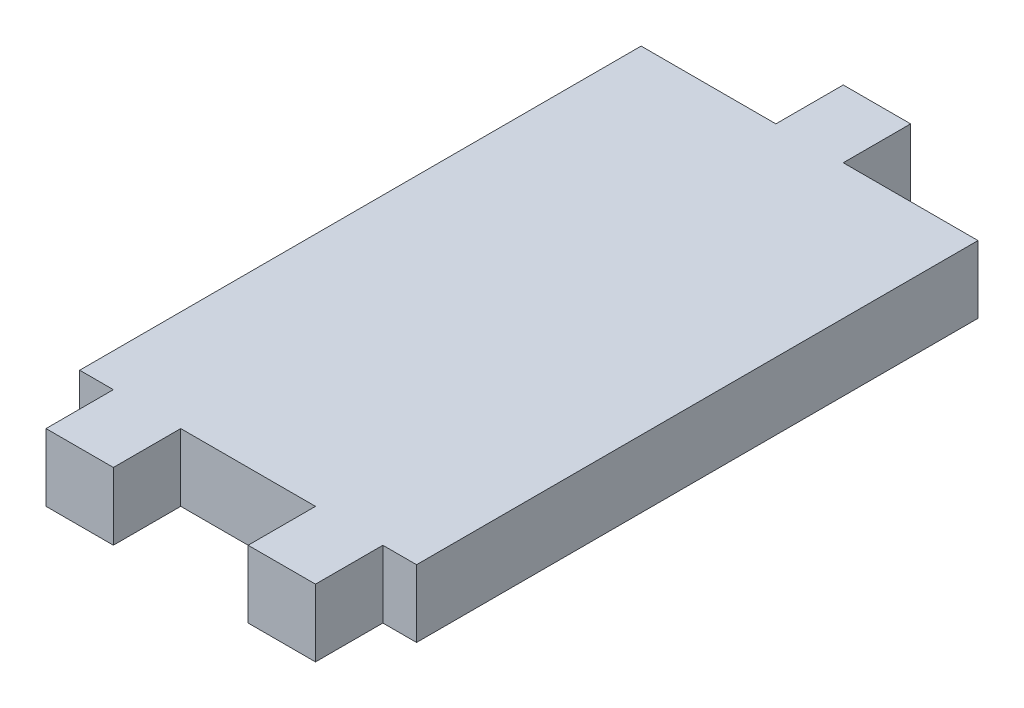
ISO-10303-21;
HEADER;
FILE_DESCRIPTION(('STEP AP214'),'2;1');
FILE_NAME('part.step','',(''),(''),'','','');
FILE_SCHEMA(('AUTOMOTIVE_DESIGN { 1 0 10303 214 1 1 1 1 }'));
ENDSEC;
DATA;
#1=APPLICATION_CONTEXT('core data for automotive mechanical design processes');
#2=APPLICATION_PROTOCOL_DEFINITION('international standard','automotive_design',2000,#1);
#3=PRODUCT_CONTEXT('',#1,'mechanical');
#4=PRODUCT('Part','Part','',(#3));
#5=PRODUCT_RELATED_PRODUCT_CATEGORY('part','',(#4));
#6=PRODUCT_DEFINITION_FORMATION('','',#4);
#7=PRODUCT_DEFINITION_CONTEXT('part definition',#1,'design');
#8=PRODUCT_DEFINITION('design','',#6,#7);
#9=PRODUCT_DEFINITION_SHAPE('','',#8);
#10=(LENGTH_UNIT() NAMED_UNIT(*) SI_UNIT(.MILLI.,.METRE.));
#11=(NAMED_UNIT(*) PLANE_ANGLE_UNIT() SI_UNIT($,.RADIAN.));
#12=(NAMED_UNIT(*) SI_UNIT($,.STERADIAN.) SOLID_ANGLE_UNIT());
#13=UNCERTAINTY_MEASURE_WITH_UNIT(LENGTH_MEASURE(1.E-05),#10,'distance_accuracy_value','');
#14=(GEOMETRIC_REPRESENTATION_CONTEXT(3) GLOBAL_UNCERTAINTY_ASSIGNED_CONTEXT((#13)) GLOBAL_UNIT_ASSIGNED_CONTEXT((#10,
#11,#12)) REPRESENTATION_CONTEXT('',''));
#15=CARTESIAN_POINT('',(0.,0.,0.));
#16=DIRECTION('',(0.,0.,1.));
#17=DIRECTION('',(1.,0.,0.));
#18=AXIS2_PLACEMENT_3D('',#15,#16,#17);
#19=CARTESIAN_POINT('',(-3.,6.,0.));
#20=DIRECTION('',(0.,0.,-1.));
#21=DIRECTION('',(-1.,0.,0.));
#22=AXIS2_PLACEMENT_3D('',#19,#20,#21);
#23=PLANE('',#22);
#24=DIRECTION('',(1.,0.,0.));
#25=VECTOR('',#24,1.);
#26=CARTESIAN_POINT('',(-3.,0.,0.));
#27=LINE('',#26,#25);
#28=CARTESIAN_POINT('',(-3.,0.,0.));
#29=VERTEX_POINT('',#28);
#30=CARTESIAN_POINT('',(0.,0.,0.));
#31=VERTEX_POINT('',#30);
#32=EDGE_CURVE('E177',#29,#31,#27,.T.);
#33=ORIENTED_EDGE('',*,*,#32,.T.);
#34=DIRECTION('',(0.,-1.,0.));
#35=VECTOR('',#34,1.);
#36=CARTESIAN_POINT('',(0.,6.,0.));
#37=LINE('',#36,#35);
#38=CARTESIAN_POINT('',(0.,6.,0.));
#39=VERTEX_POINT('',#38);
#40=EDGE_CURVE('E11',#39,#31,#37,.T.);
#41=ORIENTED_EDGE('',*,*,#40,.F.);
#42=DIRECTION('',(1.,0.,0.));
#43=VECTOR('',#42,1.);
#44=CARTESIAN_POINT('',(-3.,6.,0.));
#45=LINE('',#44,#43);
#46=CARTESIAN_POINT('',(-3.,6.,0.));
#47=VERTEX_POINT('',#46);
#48=EDGE_CURVE('E207',#47,#39,#45,.T.);
#49=ORIENTED_EDGE('',*,*,#48,.F.);
#50=DIRECTION('',(0.,-1.,0.));
#51=VECTOR('',#50,1.);
#52=CARTESIAN_POINT('',(-3.,6.,0.));
#53=LINE('',#52,#51);
#54=EDGE_CURVE('E173',#47,#29,#53,.T.);
#55=ORIENTED_EDGE('',*,*,#54,.T.);
#56=EDGE_LOOP('',(#33,#41,#49,#55));
#57=FACE_BOUND('',#56,.T.);
#58=ADVANCED_FACE('F33',(#57),#23,.F.);
#59=CARTESIAN_POINT('',(0.,6.,0.));
#60=DIRECTION('',(-1.,0.,0.));
#61=DIRECTION('',(0.,0.,1.));
#62=AXIS2_PLACEMENT_3D('',#59,#60,#61);
#63=PLANE('',#62);
#64=DIRECTION('',(0.,0.,-1.));
#65=VECTOR('',#64,1.);
#66=CARTESIAN_POINT('',(0.,0.,0.));
#67=LINE('',#66,#65);
#68=CARTESIAN_POINT('',(0.,0.,-50.));
#69=VERTEX_POINT('',#68);
#70=EDGE_CURVE('E180',#31,#69,#67,.T.);
#71=ORIENTED_EDGE('',*,*,#70,.T.);
#72=DIRECTION('',(0.,-1.,0.));
#73=VECTOR('',#72,1.);
#74=CARTESIAN_POINT('',(0.,6.,-50.));
#75=LINE('',#74,#73);
#76=CARTESIAN_POINT('',(0.,6.,-50.));
#77=VERTEX_POINT('',#76);
#78=EDGE_CURVE('E41',#77,#69,#75,.T.);
#79=ORIENTED_EDGE('',*,*,#78,.F.);
#80=DIRECTION('',(0.,0.,-1.));
#81=VECTOR('',#80,1.);
#82=CARTESIAN_POINT('',(0.,6.,0.));
#83=LINE('',#82,#81);
#84=EDGE_CURVE('E116',#39,#77,#83,.T.);
#85=ORIENTED_EDGE('',*,*,#84,.F.);
#86=ORIENTED_EDGE('',*,*,#40,.T.);
#87=EDGE_LOOP('',(#71,#79,#85,#86));
#88=FACE_BOUND('',#87,.T.);
#89=ADVANCED_FACE('F305',(#88),#63,.F.);
#90=CARTESIAN_POINT('',(0.,6.,-50.));
#91=DIRECTION('',(0.,0.,1.));
#92=DIRECTION('',(1.,0.,0.));
#93=AXIS2_PLACEMENT_3D('',#90,#91,#92);
#94=PLANE('',#93);
#95=DIRECTION('',(-1.,0.,0.));
#96=VECTOR('',#95,1.);
#97=CARTESIAN_POINT('',(0.,0.,-50.));
#98=LINE('',#97,#96);
#99=CARTESIAN_POINT('',(-12.,0.,-50.));
#100=VERTEX_POINT('',#99);
#101=EDGE_CURVE('E182',#69,#100,#98,.T.);
#102=ORIENTED_EDGE('',*,*,#101,.T.);
#103=DIRECTION('',(0.,-1.,0.));
#104=VECTOR('',#103,1.);
#105=CARTESIAN_POINT('',(-12.,6.,-50.));
#106=LINE('',#105,#104);
#107=CARTESIAN_POINT('',(-12.,6.,-50.));
#108=VERTEX_POINT('',#107);
#109=EDGE_CURVE('E238',#108,#100,#106,.T.);
#110=ORIENTED_EDGE('',*,*,#109,.F.);
#111=DIRECTION('',(-1.,0.,0.));
#112=VECTOR('',#111,1.);
#113=CARTESIAN_POINT('',(0.,6.,-50.));
#114=LINE('',#113,#112);
#115=EDGE_CURVE('E246',#77,#108,#114,.T.);
#116=ORIENTED_EDGE('',*,*,#115,.F.);
#117=ORIENTED_EDGE('',*,*,#78,.T.);
#118=EDGE_LOOP('',(#102,#110,#116,#117));
#119=FACE_BOUND('',#118,.T.);
#120=ADVANCED_FACE('F244',(#119),#94,.F.);
#121=CARTESIAN_POINT('',(-12.,6.,-50.));
#122=DIRECTION('',(-1.,0.,0.));
#123=DIRECTION('',(0.,0.,1.));
#124=AXIS2_PLACEMENT_3D('',#121,#122,#123);
#125=PLANE('',#124);
#126=DIRECTION('',(0.,0.,-1.));
#127=VECTOR('',#126,1.);
#128=CARTESIAN_POINT('',(-12.,0.,-50.));
#129=LINE('',#128,#127);
#130=CARTESIAN_POINT('',(-12.,0.,-56.));
#131=VERTEX_POINT('',#130);
#132=EDGE_CURVE('E184',#100,#131,#129,.T.);
#133=ORIENTED_EDGE('',*,*,#132,.T.);
#134=DIRECTION('',(0.,-1.,0.));
#135=VECTOR('',#134,1.);
#136=CARTESIAN_POINT('',(-12.,6.,-56.));
#137=LINE('',#136,#135);
#138=CARTESIAN_POINT('',(-12.,6.,-56.));
#139=VERTEX_POINT('',#138);
#140=EDGE_CURVE('E235',#139,#131,#137,.T.);
#141=ORIENTED_EDGE('',*,*,#140,.F.);
#142=DIRECTION('',(0.,0.,-1.));
#143=VECTOR('',#142,1.);
#144=CARTESIAN_POINT('',(-12.,6.,-50.));
#145=LINE('',#144,#143);
#146=EDGE_CURVE('E264',#108,#139,#145,.T.);
#147=ORIENTED_EDGE('',*,*,#146,.F.);
#148=ORIENTED_EDGE('',*,*,#109,.T.);
#149=EDGE_LOOP('',(#133,#141,#147,#148));
#150=FACE_BOUND('',#149,.T.);
#151=ADVANCED_FACE('F255',(#150),#125,.F.);
#152=CARTESIAN_POINT('',(-12.,6.,-56.));
#153=DIRECTION('',(0.,0.,1.));
#154=DIRECTION('',(1.,0.,0.));
#155=AXIS2_PLACEMENT_3D('',#152,#153,#154);
#156=PLANE('',#155);
#157=DIRECTION('',(-1.,0.,0.));
#158=VECTOR('',#157,1.);
#159=CARTESIAN_POINT('',(-12.,0.,-56.));
#160=LINE('',#159,#158);
#161=CARTESIAN_POINT('',(-18.,0.,-56.));
#162=VERTEX_POINT('',#161);
#163=EDGE_CURVE('E186',#131,#162,#160,.T.);
#164=ORIENTED_EDGE('',*,*,#163,.T.);
#165=DIRECTION('',(0.,-1.,0.));
#166=VECTOR('',#165,1.);
#167=CARTESIAN_POINT('',(-18.,6.,-56.));
#168=LINE('',#167,#166);
#169=CARTESIAN_POINT('',(-18.,6.,-56.));
#170=VERTEX_POINT('',#169);
#171=EDGE_CURVE('E232',#170,#162,#168,.T.);
#172=ORIENTED_EDGE('',*,*,#171,.F.);
#173=DIRECTION('',(-1.,0.,0.));
#174=VECTOR('',#173,1.);
#175=CARTESIAN_POINT('',(-12.,6.,-56.));
#176=LINE('',#175,#174);
#177=EDGE_CURVE('E261',#139,#170,#176,.T.);
#178=ORIENTED_EDGE('',*,*,#177,.F.);
#179=ORIENTED_EDGE('',*,*,#140,.T.);
#180=EDGE_LOOP('',(#164,#172,#178,#179));
#181=FACE_BOUND('',#180,.T.);
#182=ADVANCED_FACE('F259',(#181),#156,.F.);
#183=CARTESIAN_POINT('',(-18.,6.,-56.));
#184=DIRECTION('',(1.,0.,0.));
#185=DIRECTION('',(0.,0.,-1.));
#186=AXIS2_PLACEMENT_3D('',#183,#184,#185);
#187=PLANE('',#186);
#188=DIRECTION('',(0.,0.,1.));
#189=VECTOR('',#188,1.);
#190=CARTESIAN_POINT('',(-18.,0.,-56.));
#191=LINE('',#190,#189);
#192=CARTESIAN_POINT('',(-18.,0.,-50.));
#193=VERTEX_POINT('',#192);
#194=EDGE_CURVE('E188',#162,#193,#191,.T.);
#195=ORIENTED_EDGE('',*,*,#194,.T.);
#196=DIRECTION('',(0.,-1.,0.));
#197=VECTOR('',#196,1.);
#198=CARTESIAN_POINT('',(-18.,6.,-50.));
#199=LINE('',#198,#197);
#200=CARTESIAN_POINT('',(-18.,6.,-50.));
#201=VERTEX_POINT('',#200);
#202=EDGE_CURVE('E229',#201,#193,#199,.T.);
#203=ORIENTED_EDGE('',*,*,#202,.F.);
#204=DIRECTION('',(0.,0.,1.));
#205=VECTOR('',#204,1.);
#206=CARTESIAN_POINT('',(-18.,6.,-56.));
#207=LINE('',#206,#205);
#208=EDGE_CURVE('E263',#170,#201,#207,.T.);
#209=ORIENTED_EDGE('',*,*,#208,.F.);
#210=ORIENTED_EDGE('',*,*,#171,.T.);
#211=EDGE_LOOP('',(#195,#203,#209,#210));
#212=FACE_BOUND('',#211,.T.);
#213=ADVANCED_FACE('F318',(#212),#187,.F.);
#214=CARTESIAN_POINT('',(-18.,6.,-50.));
#215=DIRECTION('',(0.,0.,1.));
#216=DIRECTION('',(1.,0.,0.));
#217=AXIS2_PLACEMENT_3D('',#214,#215,#216);
#218=PLANE('',#217);
#219=DIRECTION('',(-1.,0.,0.));
#220=VECTOR('',#219,1.);
#221=CARTESIAN_POINT('',(-18.,0.,-50.));
#222=LINE('',#221,#220);
#223=CARTESIAN_POINT('',(-30.,0.,-50.));
#224=VERTEX_POINT('',#223);
#225=EDGE_CURVE('E190',#193,#224,#222,.T.);
#226=ORIENTED_EDGE('',*,*,#225,.T.);
#227=DIRECTION('',(0.,-1.,0.));
#228=VECTOR('',#227,1.);
#229=CARTESIAN_POINT('',(-30.,6.,-50.));
#230=LINE('',#229,#228);
#231=CARTESIAN_POINT('',(-30.,6.,-50.));
#232=VERTEX_POINT('',#231);
#233=EDGE_CURVE('E226',#232,#224,#230,.T.);
#234=ORIENTED_EDGE('',*,*,#233,.F.);
#235=DIRECTION('',(-1.,0.,0.));
#236=VECTOR('',#235,1.);
#237=CARTESIAN_POINT('',(-18.,6.,-50.));
#238=LINE('',#237,#236);
#239=EDGE_CURVE('E266',#201,#232,#238,.T.);
#240=ORIENTED_EDGE('',*,*,#239,.F.);
#241=ORIENTED_EDGE('',*,*,#202,.T.);
#242=EDGE_LOOP('',(#226,#234,#240,#241));
#243=FACE_BOUND('',#242,.T.);
#244=ADVANCED_FACE('F321',(#243),#218,.F.);
#245=CARTESIAN_POINT('',(-30.,6.,-50.));
#246=DIRECTION('',(1.,0.,0.));
#247=DIRECTION('',(0.,0.,-1.));
#248=AXIS2_PLACEMENT_3D('',#245,#246,#247);
#249=PLANE('',#248);
#250=DIRECTION('',(0.,0.,1.));
#251=VECTOR('',#250,1.);
#252=CARTESIAN_POINT('',(-30.,0.,-50.));
#253=LINE('',#252,#251);
#254=CARTESIAN_POINT('',(-30.,0.,0.));
#255=VERTEX_POINT('',#254);
#256=EDGE_CURVE('E192',#224,#255,#253,.T.);
#257=ORIENTED_EDGE('',*,*,#256,.T.);
#258=DIRECTION('',(0.,-1.,0.));
#259=VECTOR('',#258,1.);
#260=CARTESIAN_POINT('',(-30.,6.,0.));
#261=LINE('',#260,#259);
#262=CARTESIAN_POINT('',(-30.,6.,0.));
#263=VERTEX_POINT('',#262);
#264=EDGE_CURVE('E223',#263,#255,#261,.T.);
#265=ORIENTED_EDGE('',*,*,#264,.F.);
#266=DIRECTION('',(0.,0.,1.));
#267=VECTOR('',#266,1.);
#268=CARTESIAN_POINT('',(-30.,6.,-50.));
#269=LINE('',#268,#267);
#270=EDGE_CURVE('E272',#232,#263,#269,.T.);
#271=ORIENTED_EDGE('',*,*,#270,.F.);
#272=ORIENTED_EDGE('',*,*,#233,.T.);
#273=EDGE_LOOP('',(#257,#265,#271,#272));
#274=FACE_BOUND('',#273,.T.);
#275=ADVANCED_FACE('F325',(#274),#249,.F.);
#276=CARTESIAN_POINT('',(-30.,6.,0.));
#277=DIRECTION('',(0.,0.,-1.));
#278=DIRECTION('',(-1.,0.,0.));
#279=AXIS2_PLACEMENT_3D('',#276,#277,#278);
#280=PLANE('',#279);
#281=DIRECTION('',(1.,0.,0.));
#282=VECTOR('',#281,1.);
#283=CARTESIAN_POINT('',(-30.,0.,0.));
#284=LINE('',#283,#282);
#285=CARTESIAN_POINT('',(-27.,0.,0.));
#286=VERTEX_POINT('',#285);
#287=EDGE_CURVE('E194',#255,#286,#284,.T.);
#288=ORIENTED_EDGE('',*,*,#287,.T.);
#289=DIRECTION('',(0.,-1.,0.));
#290=VECTOR('',#289,1.);
#291=CARTESIAN_POINT('',(-27.,6.,0.));
#292=LINE('',#291,#290);
#293=CARTESIAN_POINT('',(-27.,6.,0.));
#294=VERTEX_POINT('',#293);
#295=EDGE_CURVE('E220',#294,#286,#292,.T.);
#296=ORIENTED_EDGE('',*,*,#295,.F.);
#297=DIRECTION('',(1.,0.,0.));
#298=VECTOR('',#297,1.);
#299=CARTESIAN_POINT('',(-30.,6.,0.));
#300=LINE('',#299,#298);
#301=EDGE_CURVE('E274',#263,#294,#300,.T.);
#302=ORIENTED_EDGE('',*,*,#301,.F.);
#303=ORIENTED_EDGE('',*,*,#264,.T.);
#304=EDGE_LOOP('',(#288,#296,#302,#303));
#305=FACE_BOUND('',#304,.T.);
#306=ADVANCED_FACE('F329',(#305),#280,.F.);
#307=CARTESIAN_POINT('',(-27.,6.,0.));
#308=DIRECTION('',(1.,0.,0.));
#309=DIRECTION('',(0.,0.,-1.));
#310=AXIS2_PLACEMENT_3D('',#307,#308,#309);
#311=PLANE('',#310);
#312=DIRECTION('',(0.,0.,1.));
#313=VECTOR('',#312,1.);
#314=CARTESIAN_POINT('',(-27.,0.,0.));
#315=LINE('',#314,#313);
#316=CARTESIAN_POINT('',(-27.,0.,6.));
#317=VERTEX_POINT('',#316);
#318=EDGE_CURVE('E196',#286,#317,#315,.T.);
#319=ORIENTED_EDGE('',*,*,#318,.T.);
#320=DIRECTION('',(0.,-1.,0.));
#321=VECTOR('',#320,1.);
#322=CARTESIAN_POINT('',(-27.,6.,6.));
#323=LINE('',#322,#321);
#324=CARTESIAN_POINT('',(-27.,6.,6.));
#325=VERTEX_POINT('',#324);
#326=EDGE_CURVE('E217',#325,#317,#323,.T.);
#327=ORIENTED_EDGE('',*,*,#326,.F.);
#328=DIRECTION('',(0.,0.,1.));
#329=VECTOR('',#328,1.);
#330=CARTESIAN_POINT('',(-27.,6.,0.));
#331=LINE('',#330,#329);
#332=EDGE_CURVE('E276',#294,#325,#331,.T.);
#333=ORIENTED_EDGE('',*,*,#332,.F.);
#334=ORIENTED_EDGE('',*,*,#295,.T.);
#335=EDGE_LOOP('',(#319,#327,#333,#334));
#336=FACE_BOUND('',#335,.T.);
#337=ADVANCED_FACE('F333',(#336),#311,.F.);
#338=CARTESIAN_POINT('',(-27.,6.,6.));
#339=DIRECTION('',(0.,0.,-1.));
#340=DIRECTION('',(-1.,0.,0.));
#341=AXIS2_PLACEMENT_3D('',#338,#339,#340);
#342=PLANE('',#341);
#343=DIRECTION('',(1.,0.,0.));
#344=VECTOR('',#343,1.);
#345=CARTESIAN_POINT('',(-27.,0.,6.));
#346=LINE('',#345,#344);
#347=CARTESIAN_POINT('',(-21.,0.,6.));
#348=VERTEX_POINT('',#347);
#349=EDGE_CURVE('E198',#317,#348,#346,.T.);
#350=ORIENTED_EDGE('',*,*,#349,.T.);
#351=DIRECTION('',(0.,-1.,0.));
#352=VECTOR('',#351,1.);
#353=CARTESIAN_POINT('',(-21.,6.,6.));
#354=LINE('',#353,#352);
#355=CARTESIAN_POINT('',(-21.,6.,6.));
#356=VERTEX_POINT('',#355);
#357=EDGE_CURVE('E214',#356,#348,#354,.T.);
#358=ORIENTED_EDGE('',*,*,#357,.F.);
#359=DIRECTION('',(1.,0.,0.));
#360=VECTOR('',#359,1.);
#361=CARTESIAN_POINT('',(-27.,6.,6.));
#362=LINE('',#361,#360);
#363=EDGE_CURVE('E278',#325,#356,#362,.T.);
#364=ORIENTED_EDGE('',*,*,#363,.F.);
#365=ORIENTED_EDGE('',*,*,#326,.T.);
#366=EDGE_LOOP('',(#350,#358,#364,#365));
#367=FACE_BOUND('',#366,.T.);
#368=ADVANCED_FACE('F337',(#367),#342,.F.);
#369=CARTESIAN_POINT('',(-21.,6.,6.));
#370=DIRECTION('',(-1.,0.,0.));
#371=DIRECTION('',(0.,0.,1.));
#372=AXIS2_PLACEMENT_3D('',#369,#370,#371);
#373=PLANE('',#372);
#374=DIRECTION('',(0.,0.,-1.));
#375=VECTOR('',#374,1.);
#376=CARTESIAN_POINT('',(-21.,0.,6.));
#377=LINE('',#376,#375);
#378=CARTESIAN_POINT('',(-21.,0.,0.));
#379=VERTEX_POINT('',#378);
#380=EDGE_CURVE('E200',#348,#379,#377,.T.);
#381=ORIENTED_EDGE('',*,*,#380,.T.);
#382=DIRECTION('',(0.,-1.,0.));
#383=VECTOR('',#382,1.);
#384=CARTESIAN_POINT('',(-21.,6.,0.));
#385=LINE('',#384,#383);
#386=CARTESIAN_POINT('',(-21.,6.,0.));
#387=VERTEX_POINT('',#386);
#388=EDGE_CURVE('E211',#387,#379,#385,.T.);
#389=ORIENTED_EDGE('',*,*,#388,.F.);
#390=DIRECTION('',(0.,0.,-1.));
#391=VECTOR('',#390,1.);
#392=CARTESIAN_POINT('',(-21.,6.,6.));
#393=LINE('',#392,#391);
#394=EDGE_CURVE('E280',#356,#387,#393,.T.);
#395=ORIENTED_EDGE('',*,*,#394,.F.);
#396=ORIENTED_EDGE('',*,*,#357,.T.);
#397=EDGE_LOOP('',(#381,#389,#395,#396));
#398=FACE_BOUND('',#397,.T.);
#399=ADVANCED_FACE('F286',(#398),#373,.F.);
#400=CARTESIAN_POINT('',(-21.,6.,0.));
#401=DIRECTION('',(0.,0.,-1.));
#402=DIRECTION('',(-1.,0.,0.));
#403=AXIS2_PLACEMENT_3D('',#400,#401,#402);
#404=PLANE('',#403);
#405=DIRECTION('',(1.,0.,0.));
#406=VECTOR('',#405,1.);
#407=CARTESIAN_POINT('',(-21.,0.,0.));
#408=LINE('',#407,#406);
#409=CARTESIAN_POINT('',(-9.,0.,0.));
#410=VERTEX_POINT('',#409);
#411=EDGE_CURVE('E202',#379,#410,#408,.T.);
#412=ORIENTED_EDGE('',*,*,#411,.T.);
#413=DIRECTION('',(0.,-1.,0.));
#414=VECTOR('',#413,1.);
#415=CARTESIAN_POINT('',(-9.,6.,0.));
#416=LINE('',#415,#414);
#417=CARTESIAN_POINT('',(-9.,6.,0.));
#418=VERTEX_POINT('',#417);
#419=EDGE_CURVE('E168',#418,#410,#416,.T.);
#420=ORIENTED_EDGE('',*,*,#419,.F.);
#421=DIRECTION('',(1.,0.,0.));
#422=VECTOR('',#421,1.);
#423=CARTESIAN_POINT('',(-21.,6.,0.));
#424=LINE('',#423,#422);
#425=EDGE_CURVE('E159',#387,#418,#424,.T.);
#426=ORIENTED_EDGE('',*,*,#425,.F.);
#427=ORIENTED_EDGE('',*,*,#388,.T.);
#428=EDGE_LOOP('',(#412,#420,#426,#427));
#429=FACE_BOUND('',#428,.T.);
#430=ADVANCED_FACE('F290',(#429),#404,.F.);
#431=CARTESIAN_POINT('',(-9.,6.,6.));
#432=DIRECTION('',(1.,0.,0.));
#433=DIRECTION('',(0.,0.,-1.));
#434=AXIS2_PLACEMENT_3D('',#431,#432,#433);
#435=PLANE('',#434);
#436=DIRECTION('',(0.,0.,1.));
#437=VECTOR('',#436,1.);
#438=CARTESIAN_POINT('',(-9.,0.,6.));
#439=LINE('',#438,#437);
#440=CARTESIAN_POINT('',(-9.,0.,6.));
#441=VERTEX_POINT('',#440);
#442=EDGE_CURVE('E167',#410,#441,#439,.T.);
#443=ORIENTED_EDGE('',*,*,#442,.T.);
#444=DIRECTION('',(0.,-1.,0.));
#445=VECTOR('',#444,1.);
#446=CARTESIAN_POINT('',(-9.,6.,6.));
#447=LINE('',#446,#445);
#448=CARTESIAN_POINT('',(-9.,6.,6.));
#449=VERTEX_POINT('',#448);
#450=EDGE_CURVE('E164',#449,#441,#447,.T.);
#451=ORIENTED_EDGE('',*,*,#450,.F.);
#452=DIRECTION('',(0.,0.,1.));
#453=VECTOR('',#452,1.);
#454=CARTESIAN_POINT('',(-9.,6.,6.));
#455=LINE('',#454,#453);
#456=EDGE_CURVE('E153',#418,#449,#455,.T.);
#457=ORIENTED_EDGE('',*,*,#456,.F.);
#458=ORIENTED_EDGE('',*,*,#419,.T.);
#459=EDGE_LOOP('',(#443,#451,#457,#458));
#460=FACE_BOUND('',#459,.T.);
#461=ADVANCED_FACE('F165',(#460),#435,.F.);
#462=CARTESIAN_POINT('',(-3.,6.,6.));
#463=DIRECTION('',(0.,0.,-1.));
#464=DIRECTION('',(-1.,0.,0.));
#465=AXIS2_PLACEMENT_3D('',#462,#463,#464);
#466=PLANE('',#465);
#467=DIRECTION('',(1.,0.,0.));
#468=VECTOR('',#467,1.);
#469=CARTESIAN_POINT('',(-3.,0.,6.));
#470=LINE('',#469,#468);
#471=CARTESIAN_POINT('',(-3.,0.,6.));
#472=VERTEX_POINT('',#471);
#473=EDGE_CURVE('E102',#441,#472,#470,.T.);
#474=ORIENTED_EDGE('',*,*,#473,.T.);
#475=DIRECTION('',(0.,-1.,0.));
#476=VECTOR('',#475,1.);
#477=CARTESIAN_POINT('',(-3.,6.,6.));
#478=LINE('',#477,#476);
#479=CARTESIAN_POINT('',(-3.,6.,6.));
#480=VERTEX_POINT('',#479);
#481=EDGE_CURVE('E169',#480,#472,#478,.T.);
#482=ORIENTED_EDGE('',*,*,#481,.F.);
#483=DIRECTION('',(1.,0.,0.));
#484=VECTOR('',#483,1.);
#485=CARTESIAN_POINT('',(-3.,6.,6.));
#486=LINE('',#485,#484);
#487=EDGE_CURVE('E157',#449,#480,#486,.T.);
#488=ORIENTED_EDGE('',*,*,#487,.F.);
#489=ORIENTED_EDGE('',*,*,#450,.T.);
#490=EDGE_LOOP('',(#474,#482,#488,#489));
#491=FACE_BOUND('',#490,.T.);
#492=ADVANCED_FACE('F171',(#491),#466,.F.);
#493=CARTESIAN_POINT('',(-3.,6.,0.));
#494=DIRECTION('',(-1.,0.,0.));
#495=DIRECTION('',(0.,0.,1.));
#496=AXIS2_PLACEMENT_3D('',#493,#494,#495);
#497=PLANE('',#496);
#498=DIRECTION('',(0.,0.,-1.));
#499=VECTOR('',#498,1.);
#500=CARTESIAN_POINT('',(-3.,0.,0.));
#501=LINE('',#500,#499);
#502=EDGE_CURVE('E108',#472,#29,#501,.T.);
#503=ORIENTED_EDGE('',*,*,#502,.T.);
#504=ORIENTED_EDGE('',*,*,#54,.F.);
#505=DIRECTION('',(0.,0.,-1.));
#506=VECTOR('',#505,1.);
#507=CARTESIAN_POINT('',(-3.,6.,0.));
#508=LINE('',#507,#506);
#509=EDGE_CURVE('E49',#480,#47,#508,.T.);
#510=ORIENTED_EDGE('',*,*,#509,.F.);
#511=ORIENTED_EDGE('',*,*,#481,.T.);
#512=EDGE_LOOP('',(#503,#504,#510,#511));
#513=FACE_BOUND('',#512,.T.);
#514=ADVANCED_FACE('F294',(#513),#497,.F.);
#515=CARTESIAN_POINT('',(0.,6.,0.));
#516=DIRECTION('',(0.,1.,0.));
#517=DIRECTION('',(0.,0.,1.));
#518=AXIS2_PLACEMENT_3D('',#515,#516,#517);
#519=PLANE('',#518);
#520=ORIENTED_EDGE('',*,*,#48,.T.);
#521=ORIENTED_EDGE('',*,*,#84,.T.);
#522=ORIENTED_EDGE('',*,*,#115,.T.);
#523=ORIENTED_EDGE('',*,*,#146,.T.);
#524=ORIENTED_EDGE('',*,*,#177,.T.);
#525=ORIENTED_EDGE('',*,*,#208,.T.);
#526=ORIENTED_EDGE('',*,*,#239,.T.);
#527=ORIENTED_EDGE('',*,*,#270,.T.);
#528=ORIENTED_EDGE('',*,*,#301,.T.);
#529=ORIENTED_EDGE('',*,*,#332,.T.);
#530=ORIENTED_EDGE('',*,*,#363,.T.);
#531=ORIENTED_EDGE('',*,*,#394,.T.);
#532=ORIENTED_EDGE('',*,*,#425,.T.);
#533=ORIENTED_EDGE('',*,*,#456,.T.);
#534=ORIENTED_EDGE('',*,*,#487,.T.);
#535=ORIENTED_EDGE('',*,*,#509,.T.);
#536=EDGE_LOOP('',(#520,#521,#522,#523,#524,#525,#526,#527,#528,#529,#530,#531,#532,#533,#534,#535));
#537=FACE_BOUND('',#536,.T.);
#538=ADVANCED_FACE('F155',(#537),#519,.T.);
#539=CARTESIAN_POINT('',(0.,0.,0.));
#540=DIRECTION('',(0.,1.,0.));
#541=DIRECTION('',(0.,0.,1.));
#542=AXIS2_PLACEMENT_3D('',#539,#540,#541);
#543=PLANE('',#542);
#544=ORIENTED_EDGE('',*,*,#32,.F.);
#545=ORIENTED_EDGE('',*,*,#502,.F.);
#546=ORIENTED_EDGE('',*,*,#473,.F.);
#547=ORIENTED_EDGE('',*,*,#442,.F.);
#548=ORIENTED_EDGE('',*,*,#411,.F.);
#549=ORIENTED_EDGE('',*,*,#380,.F.);
#550=ORIENTED_EDGE('',*,*,#349,.F.);
#551=ORIENTED_EDGE('',*,*,#318,.F.);
#552=ORIENTED_EDGE('',*,*,#287,.F.);
#553=ORIENTED_EDGE('',*,*,#256,.F.);
#554=ORIENTED_EDGE('',*,*,#225,.F.);
#555=ORIENTED_EDGE('',*,*,#194,.F.);
#556=ORIENTED_EDGE('',*,*,#163,.F.);
#557=ORIENTED_EDGE('',*,*,#132,.F.);
#558=ORIENTED_EDGE('',*,*,#101,.F.);
#559=ORIENTED_EDGE('',*,*,#70,.F.);
#560=EDGE_LOOP('',(#544,#545,#546,#547,#548,#549,#550,#551,#552,#553,#554,#555,#556,#557,#558,#559));
#561=FACE_BOUND('',#560,.T.);
#562=ADVANCED_FACE('F250',(#561),#543,.F.);
#563=CLOSED_SHELL('',(#58,#89,#120,#151,#182,#213,#244,#275,#306,#337,#368,#399,#430,#461,#492,
#514,#538,#562));
#564=MANIFOLD_SOLID_BREP('B2',#563);
#565=ADVANCED_BREP_SHAPE_REPRESENTATION('',(#18,#564),#14);
#566=SHAPE_DEFINITION_REPRESENTATION(#9,#565);
ENDSEC;
END-ISO-10303-21;
